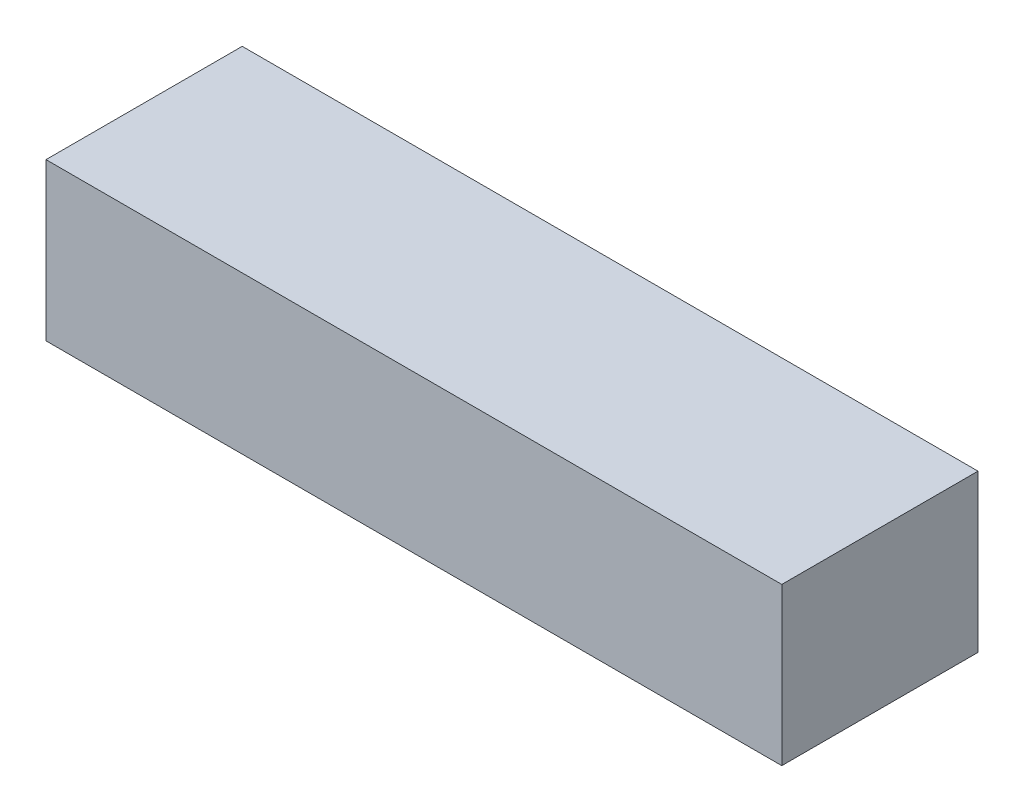
ISO-10303-21;
HEADER;
FILE_DESCRIPTION(('STEP AP214'),'2;1');
FILE_NAME('part.step','',(''),(''),'','','');
FILE_SCHEMA(('AUTOMOTIVE_DESIGN { 1 0 10303 214 1 1 1 1 }'));
ENDSEC;
DATA;
#1=APPLICATION_CONTEXT('core data for automotive mechanical design processes');
#2=APPLICATION_PROTOCOL_DEFINITION('international standard','automotive_design',2000,#1);
#3=PRODUCT_CONTEXT('',#1,'mechanical');
#4=PRODUCT('Part','Part','',(#3));
#5=PRODUCT_RELATED_PRODUCT_CATEGORY('part','',(#4));
#6=PRODUCT_DEFINITION_FORMATION('','',#4);
#7=PRODUCT_DEFINITION_CONTEXT('part definition',#1,'design');
#8=PRODUCT_DEFINITION('design','',#6,#7);
#9=PRODUCT_DEFINITION_SHAPE('','',#8);
#10=(LENGTH_UNIT() NAMED_UNIT(*) SI_UNIT(.MILLI.,.METRE.));
#11=(NAMED_UNIT(*) PLANE_ANGLE_UNIT() SI_UNIT($,.RADIAN.));
#12=(NAMED_UNIT(*) SI_UNIT($,.STERADIAN.) SOLID_ANGLE_UNIT());
#13=UNCERTAINTY_MEASURE_WITH_UNIT(LENGTH_MEASURE(1.E-05),#10,'distance_accuracy_value','');
#14=(GEOMETRIC_REPRESENTATION_CONTEXT(3) GLOBAL_UNCERTAINTY_ASSIGNED_CONTEXT((#13)) GLOBAL_UNIT_ASSIGNED_CONTEXT((#10,
#11,#12)) REPRESENTATION_CONTEXT('',''));
#15=CARTESIAN_POINT('',(0.,0.,0.));
#16=DIRECTION('',(0.,0.,1.));
#17=DIRECTION('',(1.,0.,0.));
#18=AXIS2_PLACEMENT_3D('',#15,#16,#17);
#19=CARTESIAN_POINT('',(75.,30.,-18.));
#20=DIRECTION('',(0.,0.,1.));
#21=DIRECTION('',(1.,0.,0.));
#22=AXIS2_PLACEMENT_3D('',#19,#20,#21);
#23=PLANE('',#22);
#24=DIRECTION('',(-1.,0.,0.));
#25=VECTOR('',#24,1.);
#26=CARTESIAN_POINT('',(75.,2.,-18.));
#27=LINE('',#26,#25);
#28=CARTESIAN_POINT('',(-14.7947423011028,2.,-18.));
#29=VERTEX_POINT('',#28);
#30=CARTESIAN_POINT('',(-73.,2.,-18.));
#31=VERTEX_POINT('',#30);
#32=EDGE_CURVE('E261',#29,#31,#27,.T.);
#33=ORIENTED_EDGE('',*,*,#32,.F.);
#34=DIRECTION('',(0.,-1.,0.));
#35=VECTOR('',#34,1.);
#36=CARTESIAN_POINT('',(-14.7947423011028,26.,-18.));
#37=LINE('',#36,#35);
#38=CARTESIAN_POINT('',(-14.7947423011028,5.,-18.));
#39=VERTEX_POINT('',#38);
#40=EDGE_CURVE('E218',#39,#29,#37,.T.);
#41=ORIENTED_EDGE('',*,*,#40,.F.);
#42=DIRECTION('',(1.,0.,0.));
#43=VECTOR('',#42,1.);
#44=CARTESIAN_POINT('',(75.,5.,-18.));
#45=LINE('',#44,#43);
#46=CARTESIAN_POINT('',(-14.9634993026011,5.,-18.));
#47=VERTEX_POINT('',#46);
#48=EDGE_CURVE('E299',#47,#39,#45,.T.);
#49=ORIENTED_EDGE('',*,*,#48,.F.);
#50=DIRECTION('',(0.,-1.,0.));
#51=VECTOR('',#50,1.);
#52=CARTESIAN_POINT('',(-14.9634993026011,30.,-18.));
#53=LINE('',#52,#51);
#54=CARTESIAN_POINT('',(-14.9634993026011,25.,-18.));
#55=VERTEX_POINT('',#54);
#56=EDGE_CURVE('E302',#55,#47,#53,.T.);
#57=ORIENTED_EDGE('',*,*,#56,.F.);
#58=DIRECTION('',(-1.,0.,0.));
#59=VECTOR('',#58,1.);
#60=CARTESIAN_POINT('',(75.,25.,-18.));
#61=LINE('',#60,#59);
#62=CARTESIAN_POINT('',(-14.7947423011028,25.,-18.));
#63=VERTEX_POINT('',#62);
#64=EDGE_CURVE('E168',#63,#55,#61,.T.);
#65=ORIENTED_EDGE('',*,*,#64,.F.);
#66=CARTESIAN_POINT('',(-14.7947423011028,26.,-18.));
#67=VERTEX_POINT('',#66);
#68=EDGE_CURVE('E56',#67,#63,#37,.T.);
#69=ORIENTED_EDGE('',*,*,#68,.F.);
#70=DIRECTION('',(-1.,0.,0.));
#71=VECTOR('',#70,1.);
#72=CARTESIAN_POINT('',(-14.7947423011028,26.,-18.));
#73=LINE('',#72,#71);
#74=CARTESIAN_POINT('',(5.00394522576697,26.,-18.));
#75=VERTEX_POINT('',#74);
#76=EDGE_CURVE('E194',#75,#67,#73,.T.);
#77=ORIENTED_EDGE('',*,*,#76,.F.);
#78=DIRECTION('',(0.,-1.,0.));
#79=VECTOR('',#78,1.);
#80=CARTESIAN_POINT('',(5.00394522576697,26.,-18.));
#81=LINE('',#80,#79);
#82=CARTESIAN_POINT('',(5.00394522576697,25.,-18.));
#83=VERTEX_POINT('',#82);
#84=EDGE_CURVE('E209',#75,#83,#81,.T.);
#85=ORIENTED_EDGE('',*,*,#84,.T.);
#86=CARTESIAN_POINT('',(5.0365006973989,25.,-18.));
#87=VERTEX_POINT('',#86);
#88=EDGE_CURVE('E291',#87,#83,#61,.T.);
#89=ORIENTED_EDGE('',*,*,#88,.F.);
#90=DIRECTION('',(0.,1.,0.));
#91=VECTOR('',#90,1.);
#92=CARTESIAN_POINT('',(5.0365006973989,30.,-18.));
#93=LINE('',#92,#91);
#94=CARTESIAN_POINT('',(5.03650069739891,5.,-18.));
#95=VERTEX_POINT('',#94);
#96=EDGE_CURVE('E294',#95,#87,#93,.T.);
#97=ORIENTED_EDGE('',*,*,#96,.F.);
#98=CARTESIAN_POINT('',(5.00394522576697,5.,-18.));
#99=VERTEX_POINT('',#98);
#100=EDGE_CURVE('E298',#99,#95,#45,.T.);
#101=ORIENTED_EDGE('',*,*,#100,.F.);
#102=CARTESIAN_POINT('',(5.00394522576697,2.,-18.));
#103=VERTEX_POINT('',#102);
#104=EDGE_CURVE('E204',#99,#103,#81,.T.);
#105=ORIENTED_EDGE('',*,*,#104,.T.);
#106=CARTESIAN_POINT('',(73.,2.,-18.));
#107=VERTEX_POINT('',#106);
#108=EDGE_CURVE('E264',#107,#103,#27,.T.);
#109=ORIENTED_EDGE('',*,*,#108,.F.);
#110=DIRECTION('',(0.,-1.,0.));
#111=VECTOR('',#110,1.);
#112=CARTESIAN_POINT('',(73.,30.,-18.));
#113=LINE('',#112,#111);
#114=CARTESIAN_POINT('',(73.,30.,-18.));
#115=VERTEX_POINT('',#114);
#116=EDGE_CURVE('E254',#115,#107,#113,.T.);
#117=ORIENTED_EDGE('',*,*,#116,.F.);
#118=DIRECTION('',(-1.,0.,0.));
#119=VECTOR('',#118,1.);
#120=CARTESIAN_POINT('',(75.,30.,-18.));
#121=LINE('',#120,#119);
#122=CARTESIAN_POINT('',(-73.,30.,-18.));
#123=VERTEX_POINT('',#122);
#124=EDGE_CURVE('E255',#115,#123,#121,.T.);
#125=ORIENTED_EDGE('',*,*,#124,.T.);
#126=DIRECTION('',(0.,-1.,0.));
#127=VECTOR('',#126,1.);
#128=CARTESIAN_POINT('',(-73.,30.,-18.));
#129=LINE('',#128,#127);
#130=EDGE_CURVE('E251',#123,#31,#129,.T.);
#131=ORIENTED_EDGE('',*,*,#130,.T.);
#132=EDGE_LOOP('',(#33,#41,#49,#57,#65,#69,#77,#85,#89,#97,#101,#105,#109,#117,#125,#131));
#133=FACE_BOUND('',#132,.T.);
#134=ADVANCED_FACE('F33',(#133),#23,.T.);
#135=CARTESIAN_POINT('',(0.,2.,0.));
#136=DIRECTION('',(0.,1.,0.));
#137=DIRECTION('',(0.,0.,1.));
#138=AXIS2_PLACEMENT_3D('',#135,#136,#137);
#139=PLANE('',#138);
#140=DIRECTION('',(1.,0.,0.));
#141=VECTOR('',#140,1.);
#142=CARTESIAN_POINT('',(-14.7947423011028,2.,-5.39803543136941));
#143=LINE('',#142,#141);
#144=CARTESIAN_POINT('',(-14.7947423011028,2.,-5.39803543136941));
#145=VERTEX_POINT('',#144);
#146=CARTESIAN_POINT('',(5.00394522576697,2.,-5.39803543136941));
#147=VERTEX_POINT('',#146);
#148=EDGE_CURVE('E206',#145,#147,#143,.T.);
#149=ORIENTED_EDGE('',*,*,#148,.F.);
#150=DIRECTION('',(0.,0.,1.));
#151=VECTOR('',#150,1.);
#152=CARTESIAN_POINT('',(-14.7947423011028,2.,-18.));
#153=LINE('',#152,#151);
#154=EDGE_CURVE('E193',#29,#145,#153,.T.);
#155=ORIENTED_EDGE('',*,*,#154,.F.);
#156=ORIENTED_EDGE('',*,*,#32,.T.);
#157=DIRECTION('',(0.,0.,1.));
#158=VECTOR('',#157,1.);
#159=CARTESIAN_POINT('',(-73.,2.,20.));
#160=LINE('',#159,#158);
#161=CARTESIAN_POINT('',(-73.,2.,18.));
#162=VERTEX_POINT('',#161);
#163=EDGE_CURVE('E237',#31,#162,#160,.T.);
#164=ORIENTED_EDGE('',*,*,#163,.T.);
#165=DIRECTION('',(1.,0.,0.));
#166=VECTOR('',#165,1.);
#167=CARTESIAN_POINT('',(75.,2.,18.));
#168=LINE('',#167,#166);
#169=CARTESIAN_POINT('',(73.,2.,18.));
#170=VERTEX_POINT('',#169);
#171=EDGE_CURVE('E246',#162,#170,#168,.T.);
#172=ORIENTED_EDGE('',*,*,#171,.T.);
#173=DIRECTION('',(0.,0.,-1.));
#174=VECTOR('',#173,1.);
#175=CARTESIAN_POINT('',(73.,2.,20.));
#176=LINE('',#175,#174);
#177=EDGE_CURVE('E257',#170,#107,#176,.T.);
#178=ORIENTED_EDGE('',*,*,#177,.T.);
#179=ORIENTED_EDGE('',*,*,#108,.T.);
#180=DIRECTION('',(0.,0.,-1.));
#181=VECTOR('',#180,1.);
#182=CARTESIAN_POINT('',(5.00394522576697,2.,-5.39803543136941));
#183=LINE('',#182,#181);
#184=EDGE_CURVE('E198',#147,#103,#183,.T.);
#185=ORIENTED_EDGE('',*,*,#184,.F.);
#186=EDGE_LOOP('',(#149,#155,#156,#164,#172,#178,#179,#185));
#187=FACE_BOUND('',#186,.T.);
#188=ADVANCED_FACE('F329',(#187),#139,.T.);
#189=CARTESIAN_POINT('',(-75.,30.,20.));
#190=DIRECTION('',(1.,0.,0.));
#191=DIRECTION('',(0.,0.,-1.));
#192=AXIS2_PLACEMENT_3D('',#189,#190,#191);
#193=PLANE('',#192);
#194=DIRECTION('',(0.,0.,1.));
#195=VECTOR('',#194,1.);
#196=CARTESIAN_POINT('',(-75.,0.,20.));
#197=LINE('',#196,#195);
#198=CARTESIAN_POINT('',(-75.,0.,-20.));
#199=VERTEX_POINT('',#198);
#200=CARTESIAN_POINT('',(-75.,0.,20.));
#201=VERTEX_POINT('',#200);
#202=EDGE_CURVE('E166',#199,#201,#197,.T.);
#203=ORIENTED_EDGE('',*,*,#202,.T.);
#204=DIRECTION('',(0.,-1.,0.));
#205=VECTOR('',#204,1.);
#206=CARTESIAN_POINT('',(-75.,30.,20.));
#207=LINE('',#206,#205);
#208=CARTESIAN_POINT('',(-75.,32.,20.));
#209=VERTEX_POINT('',#208);
#210=EDGE_CURVE('E160',#209,#201,#207,.T.);
#211=ORIENTED_EDGE('',*,*,#210,.F.);
#212=DIRECTION('',(0.,0.,1.));
#213=VECTOR('',#212,1.);
#214=CARTESIAN_POINT('',(-75.,32.,-20.));
#215=LINE('',#214,#213);
#216=CARTESIAN_POINT('',(-75.,32.,-20.));
#217=VERTEX_POINT('',#216);
#218=EDGE_CURVE('E164',#217,#209,#215,.T.);
#219=ORIENTED_EDGE('',*,*,#218,.F.);
#220=DIRECTION('',(0.,-1.,0.));
#221=VECTOR('',#220,1.);
#222=CARTESIAN_POINT('',(-75.,30.,-20.));
#223=LINE('',#222,#221);
#224=EDGE_CURVE('E285',#217,#199,#223,.T.);
#225=ORIENTED_EDGE('',*,*,#224,.T.);
#226=EDGE_LOOP('',(#203,#211,#219,#225));
#227=FACE_BOUND('',#226,.T.);
#228=ADVANCED_FACE('F35',(#227),#193,.F.);
#229=CARTESIAN_POINT('',(75.,30.,20.));
#230=DIRECTION('',(0.,0.,-1.));
#231=DIRECTION('',(-1.,0.,0.));
#232=AXIS2_PLACEMENT_3D('',#229,#230,#231);
#233=PLANE('',#232);
#234=DIRECTION('',(1.,0.,0.));
#235=VECTOR('',#234,1.);
#236=CARTESIAN_POINT('',(75.,0.,20.));
#237=LINE('',#236,#235);
#238=CARTESIAN_POINT('',(75.,0.,20.));
#239=VERTEX_POINT('',#238);
#240=EDGE_CURVE('E279',#201,#239,#237,.T.);
#241=ORIENTED_EDGE('',*,*,#240,.T.);
#242=DIRECTION('',(0.,-1.,0.));
#243=VECTOR('',#242,1.);
#244=CARTESIAN_POINT('',(75.,30.,20.));
#245=LINE('',#244,#243);
#246=CARTESIAN_POINT('',(75.,32.,20.));
#247=VERTEX_POINT('',#246);
#248=EDGE_CURVE('E169',#247,#239,#245,.T.);
#249=ORIENTED_EDGE('',*,*,#248,.F.);
#250=DIRECTION('',(1.,0.,0.));
#251=VECTOR('',#250,1.);
#252=CARTESIAN_POINT('',(-75.,32.,20.));
#253=LINE('',#252,#251);
#254=EDGE_CURVE('E172',#209,#247,#253,.T.);
#255=ORIENTED_EDGE('',*,*,#254,.F.);
#256=ORIENTED_EDGE('',*,*,#210,.T.);
#257=EDGE_LOOP('',(#241,#249,#255,#256));
#258=FACE_BOUND('',#257,.T.);
#259=ADVANCED_FACE('F173',(#258),#233,.F.);
#260=CARTESIAN_POINT('',(75.,30.,20.));
#261=DIRECTION('',(-1.,0.,0.));
#262=DIRECTION('',(0.,0.,1.));
#263=AXIS2_PLACEMENT_3D('',#260,#261,#262);
#264=PLANE('',#263);
#265=DIRECTION('',(0.,0.,-1.));
#266=VECTOR('',#265,1.);
#267=CARTESIAN_POINT('',(75.,0.,20.));
#268=LINE('',#267,#266);
#269=CARTESIAN_POINT('',(75.,0.,-20.));
#270=VERTEX_POINT('',#269);
#271=EDGE_CURVE('E281',#239,#270,#268,.T.);
#272=ORIENTED_EDGE('',*,*,#271,.T.);
#273=DIRECTION('',(0.,-1.,0.));
#274=VECTOR('',#273,1.);
#275=CARTESIAN_POINT('',(75.,30.,-20.));
#276=LINE('',#275,#274);
#277=CARTESIAN_POINT('',(75.,32.,-20.));
#278=VERTEX_POINT('',#277);
#279=EDGE_CURVE('E287',#278,#270,#276,.T.);
#280=ORIENTED_EDGE('',*,*,#279,.F.);
#281=DIRECTION('',(0.,0.,-1.));
#282=VECTOR('',#281,1.);
#283=CARTESIAN_POINT('',(75.,32.,-20.));
#284=LINE('',#283,#282);
#285=EDGE_CURVE('E178',#247,#278,#284,.T.);
#286=ORIENTED_EDGE('',*,*,#285,.F.);
#287=ORIENTED_EDGE('',*,*,#248,.T.);
#288=EDGE_LOOP('',(#272,#280,#286,#287));
#289=FACE_BOUND('',#288,.T.);
#290=ADVANCED_FACE('F312',(#289),#264,.F.);
#291=CARTESIAN_POINT('',(75.,30.,-20.));
#292=DIRECTION('',(0.,0.,1.));
#293=DIRECTION('',(1.,0.,0.));
#294=AXIS2_PLACEMENT_3D('',#291,#292,#293);
#295=PLANE('',#294);
#296=CARTESIAN_POINT('',(-47.,17.0208702214444,-20.));
#297=DIRECTION('',(0.,0.,1.));
#298=DIRECTION('',(1.,0.,0.));
#299=AXIS2_PLACEMENT_3D('',#296,#297,#298);
#300=CIRCLE('',#299,1.5);
#301=CARTESIAN_POINT('',(-45.5,17.0208702214444,-20.));
#302=VERTEX_POINT('',#301);
#303=EDGE_CURVE('E11',#302,#302,#300,.F.);
#304=ORIENTED_EDGE('',*,*,#303,.F.);
#305=EDGE_LOOP('',(#304));
#306=FACE_BOUND('',#305,.T.);
#307=CARTESIAN_POINT('',(46.5102055307974,16.5042687648772,-20.));
#308=DIRECTION('',(0.,0.,1.));
#309=DIRECTION('',(1.,0.,0.));
#310=AXIS2_PLACEMENT_3D('',#307,#308,#309);
#311=CIRCLE('',#310,1.5);
#312=CARTESIAN_POINT('',(48.0102055307974,16.5042687648772,-20.));
#313=VERTEX_POINT('',#312);
#314=EDGE_CURVE('E41',#313,#313,#311,.F.);
#315=ORIENTED_EDGE('',*,*,#314,.F.);
#316=EDGE_LOOP('',(#315));
#317=FACE_BOUND('',#316,.T.);
#318=DIRECTION('',(1.,0.,0.));
#319=VECTOR('',#318,1.);
#320=CARTESIAN_POINT('',(5.03650069739891,25.,-20.));
#321=LINE('',#320,#319);
#322=CARTESIAN_POINT('',(-14.9634993026011,25.,-20.));
#323=VERTEX_POINT('',#322);
#324=CARTESIAN_POINT('',(5.03650069739891,25.,-20.));
#325=VERTEX_POINT('',#324);
#326=EDGE_CURVE('E225',#323,#325,#321,.T.);
#327=ORIENTED_EDGE('',*,*,#326,.F.);
#328=DIRECTION('',(0.,1.,0.));
#329=VECTOR('',#328,1.);
#330=CARTESIAN_POINT('',(-14.9634993026011,25.,-20.));
#331=LINE('',#330,#329);
#332=CARTESIAN_POINT('',(-14.9634993026011,5.,-20.));
#333=VERTEX_POINT('',#332);
#334=EDGE_CURVE('E223',#333,#323,#331,.T.);
#335=ORIENTED_EDGE('',*,*,#334,.F.);
#336=DIRECTION('',(-1.,0.,0.));
#337=VECTOR('',#336,1.);
#338=CARTESIAN_POINT('',(5.03650069739891,5.,-20.));
#339=LINE('',#338,#337);
#340=CARTESIAN_POINT('',(5.03650069739891,5.,-20.));
#341=VERTEX_POINT('',#340);
#342=EDGE_CURVE('E231',#341,#333,#339,.T.);
#343=ORIENTED_EDGE('',*,*,#342,.F.);
#344=DIRECTION('',(0.,-1.,0.));
#345=VECTOR('',#344,1.);
#346=CARTESIAN_POINT('',(5.03650069739891,25.,-20.));
#347=LINE('',#346,#345);
#348=EDGE_CURVE('E228',#325,#341,#347,.T.);
#349=ORIENTED_EDGE('',*,*,#348,.F.);
#350=EDGE_LOOP('',(#327,#335,#343,#349));
#351=FACE_BOUND('',#350,.T.);
#352=DIRECTION('',(-1.,0.,0.));
#353=VECTOR('',#352,1.);
#354=CARTESIAN_POINT('',(75.,0.,-20.));
#355=LINE('',#354,#353);
#356=EDGE_CURVE('E283',#270,#199,#355,.T.);
#357=ORIENTED_EDGE('',*,*,#356,.T.);
#358=ORIENTED_EDGE('',*,*,#224,.F.);
#359=DIRECTION('',(-1.,0.,0.));
#360=VECTOR('',#359,1.);
#361=CARTESIAN_POINT('',(-75.,32.,-20.));
#362=LINE('',#361,#360);
#363=EDGE_CURVE('E183',#278,#217,#362,.T.);
#364=ORIENTED_EDGE('',*,*,#363,.F.);
#365=ORIENTED_EDGE('',*,*,#279,.T.);
#366=EDGE_LOOP('',(#357,#358,#364,#365));
#367=FACE_BOUND('',#366,.T.);
#368=ADVANCED_FACE('F308',(#306,#317,#351,#367),#295,.F.);
#369=CARTESIAN_POINT('',(0.,0.,0.));
#370=DIRECTION('',(0.,1.,0.));
#371=DIRECTION('',(0.,0.,1.));
#372=AXIS2_PLACEMENT_3D('',#369,#370,#371);
#373=PLANE('',#372);
#374=ORIENTED_EDGE('',*,*,#202,.F.);
#375=ORIENTED_EDGE('',*,*,#356,.F.);
#376=ORIENTED_EDGE('',*,*,#271,.F.);
#377=ORIENTED_EDGE('',*,*,#240,.F.);
#378=EDGE_LOOP('',(#374,#375,#376,#377));
#379=FACE_BOUND('',#378,.T.);
#380=ADVANCED_FACE('F311',(#379),#373,.F.);
#381=CARTESIAN_POINT('',(-73.,30.,20.));
#382=DIRECTION('',(1.,0.,0.));
#383=DIRECTION('',(0.,0.,-1.));
#384=AXIS2_PLACEMENT_3D('',#381,#382,#383);
#385=PLANE('',#384);
#386=ORIENTED_EDGE('',*,*,#163,.F.);
#387=ORIENTED_EDGE('',*,*,#130,.F.);
#388=DIRECTION('',(0.,0.,1.));
#389=VECTOR('',#388,1.);
#390=CARTESIAN_POINT('',(-73.,30.,20.));
#391=LINE('',#390,#389);
#392=CARTESIAN_POINT('',(-73.,30.,18.));
#393=VERTEX_POINT('',#392);
#394=EDGE_CURVE('E267',#123,#393,#391,.T.);
#395=ORIENTED_EDGE('',*,*,#394,.T.);
#396=DIRECTION('',(0.,-1.,0.));
#397=VECTOR('',#396,1.);
#398=CARTESIAN_POINT('',(-73.,30.,18.));
#399=LINE('',#398,#397);
#400=EDGE_CURVE('E247',#393,#162,#399,.T.);
#401=ORIENTED_EDGE('',*,*,#400,.T.);
#402=EDGE_LOOP('',(#386,#387,#395,#401));
#403=FACE_BOUND('',#402,.T.);
#404=ADVANCED_FACE('F343',(#403),#385,.T.);
#405=CARTESIAN_POINT('',(75.,30.,18.));
#406=DIRECTION('',(0.,0.,-1.));
#407=DIRECTION('',(-1.,0.,0.));
#408=AXIS2_PLACEMENT_3D('',#405,#406,#407);
#409=PLANE('',#408);
#410=ORIENTED_EDGE('',*,*,#171,.F.);
#411=ORIENTED_EDGE('',*,*,#400,.F.);
#412=DIRECTION('',(1.,0.,0.));
#413=VECTOR('',#412,1.);
#414=CARTESIAN_POINT('',(75.,30.,18.));
#415=LINE('',#414,#413);
#416=CARTESIAN_POINT('',(73.,30.,18.));
#417=VERTEX_POINT('',#416);
#418=EDGE_CURVE('E270',#393,#417,#415,.T.);
#419=ORIENTED_EDGE('',*,*,#418,.T.);
#420=DIRECTION('',(0.,-1.,0.));
#421=VECTOR('',#420,1.);
#422=CARTESIAN_POINT('',(73.,30.,18.));
#423=LINE('',#422,#421);
#424=EDGE_CURVE('E250',#417,#170,#423,.T.);
#425=ORIENTED_EDGE('',*,*,#424,.T.);
#426=EDGE_LOOP('',(#410,#411,#419,#425));
#427=FACE_BOUND('',#426,.T.);
#428=ADVANCED_FACE('F347',(#427),#409,.T.);
#429=CARTESIAN_POINT('',(73.,30.,20.));
#430=DIRECTION('',(-1.,0.,0.));
#431=DIRECTION('',(0.,0.,1.));
#432=AXIS2_PLACEMENT_3D('',#429,#430,#431);
#433=PLANE('',#432);
#434=ORIENTED_EDGE('',*,*,#177,.F.);
#435=ORIENTED_EDGE('',*,*,#424,.F.);
#436=DIRECTION('',(0.,0.,-1.));
#437=VECTOR('',#436,1.);
#438=CARTESIAN_POINT('',(73.,30.,20.));
#439=LINE('',#438,#437);
#440=EDGE_CURVE('E273',#417,#115,#439,.T.);
#441=ORIENTED_EDGE('',*,*,#440,.T.);
#442=ORIENTED_EDGE('',*,*,#116,.T.);
#443=EDGE_LOOP('',(#434,#435,#441,#442));
#444=FACE_BOUND('',#443,.T.);
#445=ADVANCED_FACE('F339',(#444),#433,.T.);
#446=CARTESIAN_POINT('',(-14.9634993026011,25.,-15.));
#447=DIRECTION('',(-1.,0.,0.));
#448=DIRECTION('',(0.,0.,1.));
#449=AXIS2_PLACEMENT_3D('',#446,#447,#448);
#450=PLANE('',#449);
#451=ORIENTED_EDGE('',*,*,#56,.T.);
#452=DIRECTION('',(0.,0.,-1.));
#453=VECTOR('',#452,1.);
#454=CARTESIAN_POINT('',(-14.9634993026011,5.,-15.));
#455=LINE('',#454,#453);
#456=EDGE_CURVE('E235',#47,#333,#455,.T.);
#457=ORIENTED_EDGE('',*,*,#456,.T.);
#458=ORIENTED_EDGE('',*,*,#334,.T.);
#459=DIRECTION('',(0.,0.,-1.));
#460=VECTOR('',#459,1.);
#461=CARTESIAN_POINT('',(-14.9634993026011,25.,-15.));
#462=LINE('',#461,#460);
#463=EDGE_CURVE('E234',#55,#323,#462,.T.);
#464=ORIENTED_EDGE('',*,*,#463,.F.);
#465=EDGE_LOOP('',(#451,#457,#458,#464));
#466=FACE_BOUND('',#465,.T.);
#467=ADVANCED_FACE('F356',(#466),#450,.F.);
#468=CARTESIAN_POINT('',(5.03650069739891,5.,-15.));
#469=DIRECTION('',(0.,-1.,0.));
#470=DIRECTION('',(0.,0.,-1.));
#471=AXIS2_PLACEMENT_3D('',#468,#469,#470);
#472=PLANE('',#471);
#473=ORIENTED_EDGE('',*,*,#48,.T.);
#474=DIRECTION('',(-1.,0.,0.));
#475=VECTOR('',#474,1.);
#476=CARTESIAN_POINT('',(5.03650069739891,5.,-18.));
#477=LINE('',#476,#475);
#478=EDGE_CURVE('E220',#99,#39,#477,.T.);
#479=ORIENTED_EDGE('',*,*,#478,.F.);
#480=ORIENTED_EDGE('',*,*,#100,.T.);
#481=DIRECTION('',(0.,0.,-1.));
#482=VECTOR('',#481,1.);
#483=CARTESIAN_POINT('',(5.03650069739891,5.,-15.));
#484=LINE('',#483,#482);
#485=EDGE_CURVE('E238',#95,#341,#484,.T.);
#486=ORIENTED_EDGE('',*,*,#485,.T.);
#487=ORIENTED_EDGE('',*,*,#342,.T.);
#488=ORIENTED_EDGE('',*,*,#456,.F.);
#489=EDGE_LOOP('',(#473,#479,#480,#486,#487,#488));
#490=FACE_BOUND('',#489,.T.);
#491=ADVANCED_FACE('F359',(#490),#472,.F.);
#492=CARTESIAN_POINT('',(5.03650069739891,25.,-15.));
#493=DIRECTION('',(1.,0.,0.));
#494=DIRECTION('',(0.,0.,-1.));
#495=AXIS2_PLACEMENT_3D('',#492,#493,#494);
#496=PLANE('',#495);
#497=ORIENTED_EDGE('',*,*,#96,.T.);
#498=DIRECTION('',(0.,0.,-1.));
#499=VECTOR('',#498,1.);
#500=CARTESIAN_POINT('',(5.03650069739891,25.,-15.));
#501=LINE('',#500,#499);
#502=EDGE_CURVE('E240',#87,#325,#501,.T.);
#503=ORIENTED_EDGE('',*,*,#502,.T.);
#504=ORIENTED_EDGE('',*,*,#348,.T.);
#505=ORIENTED_EDGE('',*,*,#485,.F.);
#506=EDGE_LOOP('',(#497,#503,#504,#505));
#507=FACE_BOUND('',#506,.T.);
#508=ADVANCED_FACE('F365',(#507),#496,.F.);
#509=CARTESIAN_POINT('',(5.03650069739891,25.,-15.));
#510=DIRECTION('',(0.,1.,0.));
#511=DIRECTION('',(0.,0.,1.));
#512=AXIS2_PLACEMENT_3D('',#509,#510,#511);
#513=PLANE('',#512);
#514=ORIENTED_EDGE('',*,*,#88,.T.);
#515=EDGE_CURVE('E295',#83,#63,#61,.T.);
#516=ORIENTED_EDGE('',*,*,#515,.T.);
#517=ORIENTED_EDGE('',*,*,#64,.T.);
#518=ORIENTED_EDGE('',*,*,#463,.T.);
#519=ORIENTED_EDGE('',*,*,#326,.T.);
#520=ORIENTED_EDGE('',*,*,#502,.F.);
#521=EDGE_LOOP('',(#514,#516,#517,#518,#519,#520));
#522=FACE_BOUND('',#521,.T.);
#523=ADVANCED_FACE('F361',(#522),#513,.F.);
#524=CARTESIAN_POINT('',(-14.7947423011028,26.,-18.));
#525=DIRECTION('',(0.,0.,1.));
#526=DIRECTION('',(1.,0.,0.));
#527=AXIS2_PLACEMENT_3D('',#524,#525,#526);
#528=PLANE('',#527);
#529=EDGE_CURVE('E48',#83,#99,#81,.T.);
#530=ORIENTED_EDGE('',*,*,#529,.T.);
#531=ORIENTED_EDGE('',*,*,#478,.T.);
#532=EDGE_CURVE('E221',#63,#39,#37,.T.);
#533=ORIENTED_EDGE('',*,*,#532,.F.);
#534=ORIENTED_EDGE('',*,*,#515,.F.);
#535=EDGE_LOOP('',(#530,#531,#533,#534));
#536=FACE_BOUND('',#535,.T.);
#537=ADVANCED_FACE('F364',(#536),#528,.F.);
#538=CARTESIAN_POINT('',(-14.7947423011028,26.,-18.));
#539=DIRECTION('',(1.,0.,0.));
#540=DIRECTION('',(0.,0.,-1.));
#541=AXIS2_PLACEMENT_3D('',#538,#539,#540);
#542=PLANE('',#541);
#543=ORIENTED_EDGE('',*,*,#154,.T.);
#544=DIRECTION('',(0.,-1.,0.));
#545=VECTOR('',#544,1.);
#546=CARTESIAN_POINT('',(-14.7947423011028,26.,-5.39803543136941));
#547=LINE('',#546,#545);
#548=CARTESIAN_POINT('',(-14.7947423011028,26.,-5.39803543136941));
#549=VERTEX_POINT('',#548);
#550=EDGE_CURVE('E215',#549,#145,#547,.T.);
#551=ORIENTED_EDGE('',*,*,#550,.F.);
#552=DIRECTION('',(0.,0.,1.));
#553=VECTOR('',#552,1.);
#554=CARTESIAN_POINT('',(-14.7947423011028,26.,-18.));
#555=LINE('',#554,#553);
#556=EDGE_CURVE('E197',#67,#549,#555,.T.);
#557=ORIENTED_EDGE('',*,*,#556,.F.);
#558=ORIENTED_EDGE('',*,*,#68,.T.);
#559=ORIENTED_EDGE('',*,*,#532,.T.);
#560=ORIENTED_EDGE('',*,*,#40,.T.);
#561=EDGE_LOOP('',(#543,#551,#557,#558,#559,#560));
#562=FACE_BOUND('',#561,.T.);
#563=ADVANCED_FACE('F375',(#562),#542,.F.);
#564=CARTESIAN_POINT('',(-14.7947423011028,26.,-5.39803543136941));
#565=DIRECTION('',(0.,0.,-1.));
#566=DIRECTION('',(-1.,0.,0.));
#567=AXIS2_PLACEMENT_3D('',#564,#565,#566);
#568=PLANE('',#567);
#569=ORIENTED_EDGE('',*,*,#148,.T.);
#570=DIRECTION('',(0.,-1.,0.));
#571=VECTOR('',#570,1.);
#572=CARTESIAN_POINT('',(5.00394522576697,26.,-5.39803543136941));
#573=LINE('',#572,#571);
#574=CARTESIAN_POINT('',(5.00394522576697,26.,-5.39803543136941));
#575=VERTEX_POINT('',#574);
#576=EDGE_CURVE('E212',#575,#147,#573,.T.);
#577=ORIENTED_EDGE('',*,*,#576,.F.);
#578=DIRECTION('',(1.,0.,0.));
#579=VECTOR('',#578,1.);
#580=CARTESIAN_POINT('',(-14.7947423011028,26.,-5.39803543136941));
#581=LINE('',#580,#579);
#582=EDGE_CURVE('E200',#549,#575,#581,.T.);
#583=ORIENTED_EDGE('',*,*,#582,.F.);
#584=ORIENTED_EDGE('',*,*,#550,.T.);
#585=EDGE_LOOP('',(#569,#577,#583,#584));
#586=FACE_BOUND('',#585,.T.);
#587=ADVANCED_FACE('F378',(#586),#568,.F.);
#588=CARTESIAN_POINT('',(5.00394522576697,26.,-5.39803543136941));
#589=DIRECTION('',(-1.,0.,0.));
#590=DIRECTION('',(0.,0.,1.));
#591=AXIS2_PLACEMENT_3D('',#588,#589,#590);
#592=PLANE('',#591);
#593=ORIENTED_EDGE('',*,*,#184,.T.);
#594=ORIENTED_EDGE('',*,*,#104,.F.);
#595=ORIENTED_EDGE('',*,*,#529,.F.);
#596=ORIENTED_EDGE('',*,*,#84,.F.);
#597=DIRECTION('',(0.,0.,-1.));
#598=VECTOR('',#597,1.);
#599=CARTESIAN_POINT('',(5.00394522576697,26.,-5.39803543136941));
#600=LINE('',#599,#598);
#601=EDGE_CURVE('E202',#575,#75,#600,.T.);
#602=ORIENTED_EDGE('',*,*,#601,.F.);
#603=ORIENTED_EDGE('',*,*,#576,.T.);
#604=EDGE_LOOP('',(#593,#594,#595,#596,#602,#603));
#605=FACE_BOUND('',#604,.T.);
#606=ADVANCED_FACE('F381',(#605),#592,.F.);
#607=CARTESIAN_POINT('',(0.,26.,0.));
#608=DIRECTION('',(0.,1.,0.));
#609=DIRECTION('',(0.,0.,1.));
#610=AXIS2_PLACEMENT_3D('',#607,#608,#609);
#611=PLANE('',#610);
#612=ORIENTED_EDGE('',*,*,#76,.T.);
#613=ORIENTED_EDGE('',*,*,#556,.T.);
#614=ORIENTED_EDGE('',*,*,#582,.T.);
#615=ORIENTED_EDGE('',*,*,#601,.T.);
#616=EDGE_LOOP('',(#612,#613,#614,#615));
#617=FACE_BOUND('',#616,.T.);
#618=ADVANCED_FACE('F385',(#617),#611,.T.);
#619=CARTESIAN_POINT('',(0.,30.,0.));
#620=DIRECTION('',(0.,1.,0.));
#621=DIRECTION('',(0.,0.,1.));
#622=AXIS2_PLACEMENT_3D('',#619,#620,#621);
#623=PLANE('',#622);
#624=ORIENTED_EDGE('',*,*,#124,.F.);
#625=ORIENTED_EDGE('',*,*,#440,.F.);
#626=ORIENTED_EDGE('',*,*,#418,.F.);
#627=ORIENTED_EDGE('',*,*,#394,.F.);
#628=EDGE_LOOP('',(#624,#625,#626,#627));
#629=FACE_BOUND('',#628,.T.);
#630=ADVANCED_FACE('F389',(#629),#623,.F.);
#631=CARTESIAN_POINT('',(0.,32.,0.));
#632=DIRECTION('',(0.,1.,0.));
#633=DIRECTION('',(0.,0.,1.));
#634=AXIS2_PLACEMENT_3D('',#631,#632,#633);
#635=PLANE('',#634);
#636=ORIENTED_EDGE('',*,*,#218,.T.);
#637=ORIENTED_EDGE('',*,*,#254,.T.);
#638=ORIENTED_EDGE('',*,*,#285,.T.);
#639=ORIENTED_EDGE('',*,*,#363,.T.);
#640=EDGE_LOOP('',(#636,#637,#638,#639));
#641=FACE_BOUND('',#640,.T.);
#642=ADVANCED_FACE('F181',(#641),#635,.T.);
#643=CARTESIAN_POINT('',(46.5102055307974,16.5042687648772,-25.));
#644=DIRECTION('',(0.,0.,1.));
#645=DIRECTION('',(1.,0.,0.));
#646=AXIS2_PLACEMENT_3D('',#643,#644,#645);
#647=CYLINDRICAL_SURFACE('',#646,1.5);
#648=CARTESIAN_POINT('',(46.5102055307974,16.5042687648772,-25.));
#649=DIRECTION('',(0.,0.,-1.));
#650=DIRECTION('',(-1.,0.,0.));
#651=AXIS2_PLACEMENT_3D('',#648,#649,#650);
#652=CIRCLE('',#651,1.5);
#653=CARTESIAN_POINT('',(45.0102055307974,16.5042687648772,-25.));
#654=VERTEX_POINT('',#653);
#655=EDGE_CURVE('E184',#654,#654,#652,.T.);
#656=ORIENTED_EDGE('',*,*,#655,.F.);
#657=EDGE_LOOP('',(#656));
#658=FACE_BOUND('',#657,.T.);
#659=ORIENTED_EDGE('',*,*,#314,.T.);
#660=EDGE_LOOP('',(#659));
#661=FACE_BOUND('',#660,.T.);
#662=ADVANCED_FACE('F306',(#658,#661),#647,.T.);
#663=CARTESIAN_POINT('',(46.5102055307974,16.5042687648772,-25.));
#664=DIRECTION('',(0.,0.,-1.));
#665=DIRECTION('',(-1.,0.,0.));
#666=AXIS2_PLACEMENT_3D('',#663,#664,#665);
#667=PLANE('',#666);
#668=ORIENTED_EDGE('',*,*,#655,.T.);
#669=EDGE_LOOP('',(#668));
#670=FACE_BOUND('',#669,.T.);
#671=ADVANCED_FACE('F398',(#670),#667,.T.);
#672=CARTESIAN_POINT('',(-47.,17.0208702214444,-25.));
#673=DIRECTION('',(0.,0.,1.));
#674=DIRECTION('',(1.,0.,0.));
#675=AXIS2_PLACEMENT_3D('',#672,#673,#674);
#676=CYLINDRICAL_SURFACE('',#675,1.5);
#677=CARTESIAN_POINT('',(-47.,17.0208702214444,-25.));
#678=DIRECTION('',(0.,0.,-1.));
#679=DIRECTION('',(-1.,0.,0.));
#680=AXIS2_PLACEMENT_3D('',#677,#678,#679);
#681=CIRCLE('',#680,1.5);
#682=CARTESIAN_POINT('',(-48.5,17.0208702214444,-25.));
#683=VERTEX_POINT('',#682);
#684=EDGE_CURVE('E187',#683,#683,#681,.T.);
#685=ORIENTED_EDGE('',*,*,#684,.F.);
#686=EDGE_LOOP('',(#685));
#687=FACE_BOUND('',#686,.T.);
#688=ORIENTED_EDGE('',*,*,#303,.T.);
#689=EDGE_LOOP('',(#688));
#690=FACE_BOUND('',#689,.T.);
#691=ADVANCED_FACE('F402',(#687,#690),#676,.T.);
#692=CARTESIAN_POINT('',(-47.,17.0208702214444,-25.));
#693=DIRECTION('',(0.,0.,-1.));
#694=DIRECTION('',(-1.,0.,0.));
#695=AXIS2_PLACEMENT_3D('',#692,#693,#694);
#696=PLANE('',#695);
#697=ORIENTED_EDGE('',*,*,#684,.T.);
#698=EDGE_LOOP('',(#697));
#699=FACE_BOUND('',#698,.T.);
#700=ADVANCED_FACE('F406',(#699),#696,.T.);
#701=CLOSED_SHELL('',(#134,#188,#228,#259,#290,#368,#380,#404,#428,#445,#467,#491,#508,#523,
#537,#563,#587,#606,#618,#630,#642,#662,#671,#691,#700));
#702=MANIFOLD_SOLID_BREP('B2',#701);
#703=ADVANCED_BREP_SHAPE_REPRESENTATION('',(#18,#702),#14);
#704=SHAPE_DEFINITION_REPRESENTATION(#9,#703);
ENDSEC;
END-ISO-10303-21;
